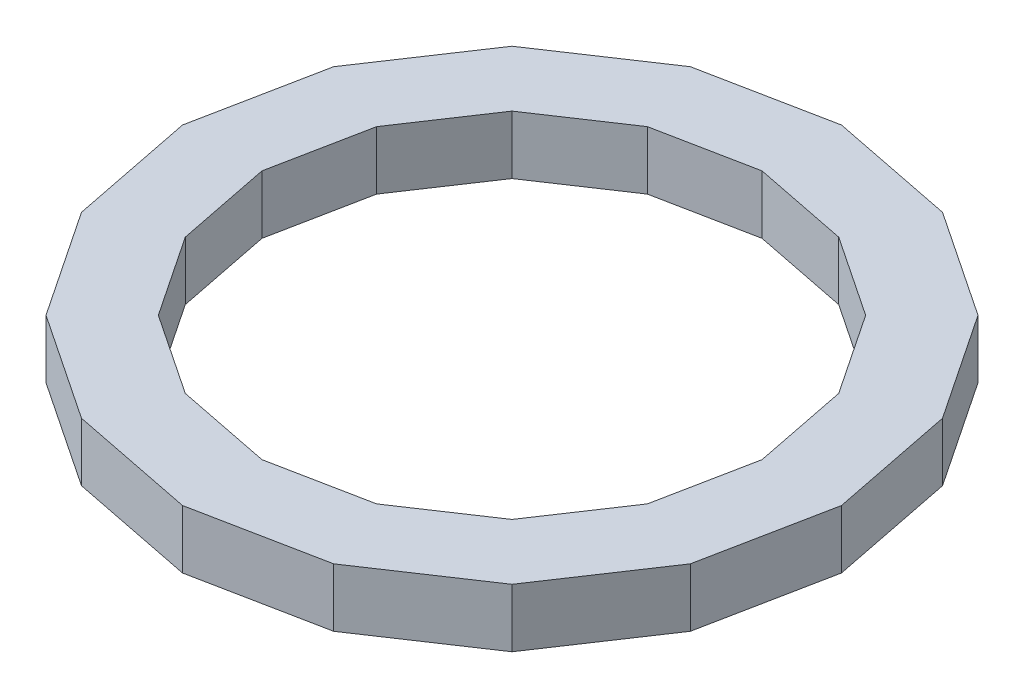
ISO-10303-21;
HEADER;
FILE_DESCRIPTION(('STEP AP214'),'2;1');
FILE_NAME('part.step','',(''),(''),'','','');
FILE_SCHEMA(('AUTOMOTIVE_DESIGN { 1 0 10303 214 1 1 1 1 }'));
ENDSEC;
DATA;
#1=APPLICATION_CONTEXT('core data for automotive mechanical design processes');
#2=APPLICATION_PROTOCOL_DEFINITION('international standard','automotive_design',2000,#1);
#3=PRODUCT_CONTEXT('',#1,'mechanical');
#4=PRODUCT('Part','Part','',(#3));
#5=PRODUCT_RELATED_PRODUCT_CATEGORY('part','',(#4));
#6=PRODUCT_DEFINITION_FORMATION('','',#4);
#7=PRODUCT_DEFINITION_CONTEXT('part definition',#1,'design');
#8=PRODUCT_DEFINITION('design','',#6,#7);
#9=PRODUCT_DEFINITION_SHAPE('','',#8);
#10=(LENGTH_UNIT() NAMED_UNIT(*) SI_UNIT(.MILLI.,.METRE.));
#11=(NAMED_UNIT(*) PLANE_ANGLE_UNIT() SI_UNIT($,.RADIAN.));
#12=(NAMED_UNIT(*) SI_UNIT($,.STERADIAN.) SOLID_ANGLE_UNIT());
#13=UNCERTAINTY_MEASURE_WITH_UNIT(LENGTH_MEASURE(1.E-05),#10,'distance_accuracy_value','');
#14=(GEOMETRIC_REPRESENTATION_CONTEXT(3) GLOBAL_UNCERTAINTY_ASSIGNED_CONTEXT((#13)) GLOBAL_UNIT_ASSIGNED_CONTEXT((#10,
#11,#12)) REPRESENTATION_CONTEXT('',''));
#15=CARTESIAN_POINT('',(0.,0.,0.));
#16=DIRECTION('',(0.,0.,1.));
#17=DIRECTION('',(1.,0.,0.));
#18=AXIS2_PLACEMENT_3D('',#15,#16,#17);
#19=CARTESIAN_POINT('',(0.,19.05,0.));
#20=DIRECTION('',(0.,1.,0.));
#21=DIRECTION('',(0.,0.,1.));
#22=AXIS2_PLACEMENT_3D('',#19,#20,#21);
#23=PLANE('',#22);
#24=DIRECTION('',(0.195090322016117,0.,-0.980785280403233));
#25=VECTOR('',#24,1.);
#26=CARTESIAN_POINT('',(99.2355510191511,19.05,41.1047111016982));
#27=LINE('',#26,#25);
#28=CARTESIAN_POINT('',(99.2355510191511,19.05,41.1047111016982));
#29=VERTEX_POINT('',#28);
#30=CARTESIAN_POINT('',(107.411786414847,19.05,-1.22818165278149E-12));
#31=VERTEX_POINT('',#30);
#32=EDGE_CURVE('E370',#29,#31,#27,.T.);
#33=ORIENTED_EDGE('',*,*,#32,.T.);
#34=DIRECTION('',(-0.195090322016139,0.,-0.980785280403228));
#35=VECTOR('',#34,1.);
#36=CARTESIAN_POINT('',(107.411786414847,19.05,-1.22818165278149E-12));
#37=LINE('',#36,#35);
#38=CARTESIAN_POINT('',(99.2355510191502,19.05,-41.1047111017005));
#39=VERTEX_POINT('',#38);
#40=EDGE_CURVE('E373',#31,#39,#37,.T.);
#41=ORIENTED_EDGE('',*,*,#40,.T.);
#42=DIRECTION('',(-0.555570233019612,0.,-0.831469612302539));
#43=VECTOR('',#42,1.);
#44=CARTESIAN_POINT('',(99.2355510191502,19.05,-41.1047111017005));
#45=LINE('',#44,#43);
#46=CARTESIAN_POINT('',(75.9516025532982,19.05,-75.9516025532999));
#47=VERTEX_POINT('',#46);
#48=EDGE_CURVE('E376',#39,#47,#45,.T.);
#49=ORIENTED_EDGE('',*,*,#48,.T.);
#50=DIRECTION('',(-0.831469612302552,0.,-0.555570233019593));
#51=VECTOR('',#50,1.);
#52=CARTESIAN_POINT('',(75.9516025532982,19.05,-75.9516025532999));
#53=LINE('',#52,#51);
#54=CARTESIAN_POINT('',(41.1047111016984,19.05,-99.235551019151));
#55=VERTEX_POINT('',#54);
#56=EDGE_CURVE('E378',#47,#55,#53,.T.);
#57=ORIENTED_EDGE('',*,*,#56,.T.);
#58=DIRECTION('',(-0.980785280403233,0.,-0.195090322016117));
#59=VECTOR('',#58,1.);
#60=CARTESIAN_POINT('',(41.1047111016984,19.05,-99.235551019151));
#61=LINE('',#60,#59);
#62=CARTESIAN_POINT('',(-1.26318645391088E-12,19.05,-107.411786414846));
#63=VERTEX_POINT('',#62);
#64=EDGE_CURVE('E380',#55,#63,#61,.T.);
#65=ORIENTED_EDGE('',*,*,#64,.T.);
#66=DIRECTION('',(-0.980785280403228,0.,0.195090322016139));
#67=VECTOR('',#66,1.);
#68=CARTESIAN_POINT('',(-1.26318645391088E-12,19.05,-107.411786414846));
#69=LINE('',#68,#67);
#70=CARTESIAN_POINT('',(-41.1047111017004,19.05,-99.2355510191501));
#71=VERTEX_POINT('',#70);
#72=EDGE_CURVE('E382',#63,#71,#69,.T.);
#73=ORIENTED_EDGE('',*,*,#72,.T.);
#74=DIRECTION('',(-0.831469612302539,0.,0.555570233019612));
#75=VECTOR('',#74,1.);
#76=CARTESIAN_POINT('',(-41.1047111017004,19.05,-99.2355510191501));
#77=LINE('',#76,#75);
#78=CARTESIAN_POINT('',(-75.9516025532999,19.05,-75.9516025532981));
#79=VERTEX_POINT('',#78);
#80=EDGE_CURVE('E384',#71,#79,#77,.T.);
#81=ORIENTED_EDGE('',*,*,#80,.T.);
#82=DIRECTION('',(-0.555570233019593,0.,0.831469612302551));
#83=VECTOR('',#82,1.);
#84=CARTESIAN_POINT('',(-75.9516025532999,19.05,-75.9516025532981));
#85=LINE('',#84,#83);
#86=CARTESIAN_POINT('',(-99.235551019151,19.05,-41.1047111016983));
#87=VERTEX_POINT('',#86);
#88=EDGE_CURVE('E386',#79,#87,#85,.T.);
#89=ORIENTED_EDGE('',*,*,#88,.T.);
#90=DIRECTION('',(-0.195090322016117,0.,0.980785280403233));
#91=VECTOR('',#90,1.);
#92=CARTESIAN_POINT('',(-99.235551019151,19.05,-41.1047111016983));
#93=LINE('',#92,#91);
#94=CARTESIAN_POINT('',(-107.411786414846,19.05,1.29125826178143E-12));
#95=VERTEX_POINT('',#94);
#96=EDGE_CURVE('E389',#87,#95,#93,.T.);
#97=ORIENTED_EDGE('',*,*,#96,.T.);
#98=DIRECTION('',(0.195090322016139,0.,0.980785280403228));
#99=VECTOR('',#98,1.);
#100=CARTESIAN_POINT('',(-107.411786414846,19.05,1.29125826178143E-12));
#101=LINE('',#100,#99);
#102=CARTESIAN_POINT('',(-99.2355510191501,19.05,41.1047111017005));
#103=VERTEX_POINT('',#102);
#104=EDGE_CURVE('E391',#95,#103,#101,.T.);
#105=ORIENTED_EDGE('',*,*,#104,.T.);
#106=DIRECTION('',(0.555570233019612,0.,0.831469612302539));
#107=VECTOR('',#106,1.);
#108=CARTESIAN_POINT('',(-99.2355510191501,19.05,41.1047111017005));
#109=LINE('',#108,#107);
#110=CARTESIAN_POINT('',(-75.9516025532982,19.05,75.9516025532999));
#111=VERTEX_POINT('',#110);
#112=EDGE_CURVE('E393',#103,#111,#109,.T.);
#113=ORIENTED_EDGE('',*,*,#112,.T.);
#114=DIRECTION('',(0.831469612302552,0.,0.555570233019593));
#115=VECTOR('',#114,1.);
#116=CARTESIAN_POINT('',(-75.9516025532982,19.05,75.9516025532999));
#117=LINE('',#116,#115);
#118=CARTESIAN_POINT('',(-41.1047111016982,19.05,99.2355510191511));
#119=VERTEX_POINT('',#118);
#120=EDGE_CURVE('E396',#111,#119,#117,.T.);
#121=ORIENTED_EDGE('',*,*,#120,.T.);
#122=DIRECTION('',(0.980785280403233,0.,0.195090322016117));
#123=VECTOR('',#122,1.);
#124=CARTESIAN_POINT('',(-41.1047111016982,19.05,99.2355510191511));
#125=LINE('',#124,#123);
#126=CARTESIAN_POINT('',(1.20605816303914E-12,19.05,107.411786414847));
#127=VERTEX_POINT('',#126);
#128=EDGE_CURVE('E399',#119,#127,#125,.T.);
#129=ORIENTED_EDGE('',*,*,#128,.T.);
#130=DIRECTION('',(0.980785280403228,0.,-0.195090322016139));
#131=VECTOR('',#130,1.);
#132=CARTESIAN_POINT('',(1.20605816303914E-12,19.05,107.411786414847));
#133=LINE('',#132,#131);
#134=CARTESIAN_POINT('',(41.1047111017004,19.05,99.2355510191502));
#135=VERTEX_POINT('',#134);
#136=EDGE_CURVE('E401',#127,#135,#133,.T.);
#137=ORIENTED_EDGE('',*,*,#136,.T.);
#138=DIRECTION('',(0.831469612302539,0.,-0.555570233019612));
#139=VECTOR('',#138,1.);
#140=CARTESIAN_POINT('',(41.1047111017004,19.05,99.2355510191502));
#141=LINE('',#140,#139);
#142=CARTESIAN_POINT('',(75.9516025532999,19.05,75.9516025532982));
#143=VERTEX_POINT('',#142);
#144=EDGE_CURVE('E404',#135,#143,#141,.T.);
#145=ORIENTED_EDGE('',*,*,#144,.T.);
#146=DIRECTION('',(0.555570233019593,0.,-0.831469612302551));
#147=VECTOR('',#146,1.);
#148=CARTESIAN_POINT('',(75.9516025532999,19.05,75.9516025532982));
#149=LINE('',#148,#147);
#150=EDGE_CURVE('E407',#143,#29,#149,.T.);
#151=ORIENTED_EDGE('',*,*,#150,.T.);
#152=EDGE_LOOP('',(#33,#41,#49,#57,#65,#73,#81,#89,#97,#105,#113,#121,#129,#137,#145,#151));
#153=FACE_BOUND('',#152,.T.);
#154=DIRECTION('',(-0.195090322016139,0.,-0.980785280403228));
#155=VECTOR('',#154,1.);
#156=CARTESIAN_POINT('',(81.5141709963552,19.05,-9.22781849097873E-13));
#157=LINE('',#156,#155);
#158=CARTESIAN_POINT('',(81.5141709963552,19.05,-9.22781849097873E-13));
#159=VERTEX_POINT('',#158);
#160=CARTESIAN_POINT('',(75.3092741931574,19.05,-31.1941227432809));
#161=VERTEX_POINT('',#160);
#162=EDGE_CURVE('E252',#159,#161,#157,.T.);
#163=ORIENTED_EDGE('',*,*,#162,.F.);
#164=DIRECTION('',(0.195090322016117,0.,-0.980785280403233));
#165=VECTOR('',#164,1.);
#166=CARTESIAN_POINT('',(75.3092741931581,19.05,31.1941227432793));
#167=LINE('',#166,#165);
#168=CARTESIAN_POINT('',(75.3092741931581,19.05,31.1941227432793));
#169=VERTEX_POINT('',#168);
#170=EDGE_CURVE('E243',#169,#159,#167,.T.);
#171=ORIENTED_EDGE('',*,*,#170,.F.);
#172=DIRECTION('',(0.555570233019593,0.,-0.831469612302552));
#173=VECTOR('',#172,1.);
#174=CARTESIAN_POINT('',(57.6392230743233,19.05,57.6392230743219));
#175=LINE('',#174,#173);
#176=CARTESIAN_POINT('',(57.6392230743233,19.05,57.6392230743219));
#177=VERTEX_POINT('',#176);
#178=EDGE_CURVE('E295',#177,#169,#175,.T.);
#179=ORIENTED_EDGE('',*,*,#178,.F.);
#180=DIRECTION('',(0.831469612302539,0.,-0.555570233019612));
#181=VECTOR('',#180,1.);
#182=CARTESIAN_POINT('',(31.194122743281,19.05,75.3092741931574));
#183=LINE('',#182,#181);
#184=CARTESIAN_POINT('',(31.194122743281,19.05,75.3092741931574));
#185=VERTEX_POINT('',#184);
#186=EDGE_CURVE('E293',#185,#177,#183,.T.);
#187=ORIENTED_EDGE('',*,*,#186,.F.);
#188=DIRECTION('',(0.980785280403228,0.,-0.19509032201614));
#189=VECTOR('',#188,1.);
#190=CARTESIAN_POINT('',(9.34889372670336E-13,19.05,81.5141709963552));
#191=LINE('',#190,#189);
#192=CARTESIAN_POINT('',(9.34889372670336E-13,19.05,81.5141709963552));
#193=VERTEX_POINT('',#192);
#194=EDGE_CURVE('E291',#193,#185,#191,.T.);
#195=ORIENTED_EDGE('',*,*,#194,.F.);
#196=DIRECTION('',(0.980785280403233,0.,0.195090322016117));
#197=VECTOR('',#196,1.);
#198=CARTESIAN_POINT('',(-31.1941227432792,19.05,75.3092741931581));
#199=LINE('',#198,#197);
#200=CARTESIAN_POINT('',(-31.1941227432792,19.05,75.3092741931581));
#201=VERTEX_POINT('',#200);
#202=EDGE_CURVE('E289',#201,#193,#199,.T.);
#203=ORIENTED_EDGE('',*,*,#202,.F.);
#204=DIRECTION('',(0.831469612302552,0.,0.555570233019593));
#205=VECTOR('',#204,1.);
#206=CARTESIAN_POINT('',(-57.6392230743219,19.05,57.6392230743233));
#207=LINE('',#206,#205);
#208=CARTESIAN_POINT('',(-57.6392230743219,19.05,57.6392230743233));
#209=VERTEX_POINT('',#208);
#210=EDGE_CURVE('E287',#209,#201,#207,.T.);
#211=ORIENTED_EDGE('',*,*,#210,.F.);
#212=DIRECTION('',(0.555570233019612,0.,0.831469612302539));
#213=VECTOR('',#212,1.);
#214=CARTESIAN_POINT('',(-75.3092741931574,19.05,31.1941227432809));
#215=LINE('',#214,#213);
#216=CARTESIAN_POINT('',(-75.3092741931574,19.05,31.1941227432809));
#217=VERTEX_POINT('',#216);
#218=EDGE_CURVE('E285',#217,#209,#215,.T.);
#219=ORIENTED_EDGE('',*,*,#218,.F.);
#220=DIRECTION('',(0.195090322016139,0.,0.980785280403228));
#221=VECTOR('',#220,1.);
#222=CARTESIAN_POINT('',(-81.5141709963552,19.05,9.90744858322315E-13));
#223=LINE('',#222,#221);
#224=CARTESIAN_POINT('',(-81.5141709963552,19.05,9.90744858322315E-13));
#225=VERTEX_POINT('',#224);
#226=EDGE_CURVE('E283',#225,#217,#223,.T.);
#227=ORIENTED_EDGE('',*,*,#226,.F.);
#228=DIRECTION('',(-0.195090322016117,0.,0.980785280403233));
#229=VECTOR('',#228,1.);
#230=CARTESIAN_POINT('',(-75.3092741931581,19.05,-31.1941227432792));
#231=LINE('',#230,#229);
#232=CARTESIAN_POINT('',(-75.3092741931581,19.05,-31.1941227432792));
#233=VERTEX_POINT('',#232);
#234=EDGE_CURVE('E280',#233,#225,#231,.T.);
#235=ORIENTED_EDGE('',*,*,#234,.F.);
#236=DIRECTION('',(-0.555570233019592,0.,0.831469612302552));
#237=VECTOR('',#236,1.);
#238=CARTESIAN_POINT('',(-57.6392230743232,19.05,-57.6392230743218));
#239=LINE('',#238,#237);
#240=CARTESIAN_POINT('',(-57.6392230743232,19.05,-57.6392230743218));
#241=VERTEX_POINT('',#240);
#242=EDGE_CURVE('E277',#241,#233,#239,.T.);
#243=ORIENTED_EDGE('',*,*,#242,.F.);
#244=DIRECTION('',(-0.831469612302539,0.,0.555570233019612));
#245=VECTOR('',#244,1.);
#246=CARTESIAN_POINT('',(-31.1941227432809,19.05,-75.3092741931574));
#247=LINE('',#246,#245);
#248=CARTESIAN_POINT('',(-31.1941227432809,19.05,-75.3092741931574));
#249=VERTEX_POINT('',#248);
#250=EDGE_CURVE('E275',#249,#241,#247,.T.);
#251=ORIENTED_EDGE('',*,*,#250,.F.);
#252=DIRECTION('',(-0.980785280403228,0.,0.19509032201614));
#253=VECTOR('',#252,1.);
#254=CARTESIAN_POINT('',(-9.92922192206594E-13,19.05,-81.5141709963552));
#255=LINE('',#254,#253);
#256=CARTESIAN_POINT('',(-9.92922192206594E-13,19.05,-81.5141709963552));
#257=VERTEX_POINT('',#256);
#258=EDGE_CURVE('E273',#257,#249,#255,.T.);
#259=ORIENTED_EDGE('',*,*,#258,.F.);
#260=DIRECTION('',(-0.980785280403233,0.,-0.195090322016117));
#261=VECTOR('',#260,1.);
#262=CARTESIAN_POINT('',(31.1941227432793,19.05,-75.309274193158));
#263=LINE('',#262,#261);
#264=CARTESIAN_POINT('',(31.1941227432793,19.05,-75.309274193158));
#265=VERTEX_POINT('',#264);
#266=EDGE_CURVE('E271',#265,#257,#263,.T.);
#267=ORIENTED_EDGE('',*,*,#266,.F.);
#268=DIRECTION('',(-0.831469612302552,0.,-0.555570233019592));
#269=VECTOR('',#268,1.);
#270=CARTESIAN_POINT('',(57.6392230743219,19.05,-57.6392230743232));
#271=LINE('',#270,#269);
#272=CARTESIAN_POINT('',(57.6392230743219,19.05,-57.6392230743232));
#273=VERTEX_POINT('',#272);
#274=EDGE_CURVE('E267',#273,#265,#271,.T.);
#275=ORIENTED_EDGE('',*,*,#274,.F.);
#276=DIRECTION('',(-0.555570233019612,0.,-0.831469612302539));
#277=VECTOR('',#276,1.);
#278=CARTESIAN_POINT('',(75.3092741931574,19.05,-31.1941227432809));
#279=LINE('',#278,#277);
#280=EDGE_CURVE('E265',#161,#273,#279,.T.);
#281=ORIENTED_EDGE('',*,*,#280,.F.);
#282=EDGE_LOOP('',(#163,#171,#179,#187,#195,#203,#211,#219,#227,#235,#243,#251,#259,#267,#275,#281));
#283=FACE_BOUND('',#282,.T.);
#284=ADVANCED_FACE('F34',(#153,#283),#23,.T.);
#285=CARTESIAN_POINT('',(0.,0.,0.));
#286=DIRECTION('',(0.,1.,0.));
#287=DIRECTION('',(0.,0.,1.));
#288=AXIS2_PLACEMENT_3D('',#285,#286,#287);
#289=PLANE('',#288);
#290=DIRECTION('',(0.195090322016117,0.,-0.980785280403233));
#291=VECTOR('',#290,1.);
#292=CARTESIAN_POINT('',(99.2355510191511,0.,41.1047111016982));
#293=LINE('',#292,#291);
#294=CARTESIAN_POINT('',(99.2355510191511,0.,41.1047111016982));
#295=VERTEX_POINT('',#294);
#296=CARTESIAN_POINT('',(107.411786414847,0.,-1.22818165278149E-12));
#297=VERTEX_POINT('',#296);
#298=EDGE_CURVE('E260',#295,#297,#293,.T.);
#299=ORIENTED_EDGE('',*,*,#298,.F.);
#300=DIRECTION('',(0.555570233019593,0.,-0.831469612302551));
#301=VECTOR('',#300,1.);
#302=CARTESIAN_POINT('',(75.9516025532999,0.,75.9516025532982));
#303=LINE('',#302,#301);
#304=CARTESIAN_POINT('',(75.9516025532999,0.,75.9516025532982));
#305=VERTEX_POINT('',#304);
#306=EDGE_CURVE('E374',#305,#295,#303,.T.);
#307=ORIENTED_EDGE('',*,*,#306,.F.);
#308=DIRECTION('',(0.831469612302539,0.,-0.555570233019612));
#309=VECTOR('',#308,1.);
#310=CARTESIAN_POINT('',(41.1047111017004,0.,99.2355510191502));
#311=LINE('',#310,#309);
#312=CARTESIAN_POINT('',(41.1047111017004,0.,99.2355510191502));
#313=VERTEX_POINT('',#312);
#314=EDGE_CURVE('E442',#313,#305,#311,.T.);
#315=ORIENTED_EDGE('',*,*,#314,.F.);
#316=DIRECTION('',(0.980785280403228,0.,-0.195090322016139));
#317=VECTOR('',#316,1.);
#318=CARTESIAN_POINT('',(1.20605816303914E-12,0.,107.411786414847));
#319=LINE('',#318,#317);
#320=CARTESIAN_POINT('',(1.20605816303914E-12,0.,107.411786414847));
#321=VERTEX_POINT('',#320);
#322=EDGE_CURVE('E439',#321,#313,#319,.T.);
#323=ORIENTED_EDGE('',*,*,#322,.F.);
#324=DIRECTION('',(0.980785280403233,0.,0.195090322016117));
#325=VECTOR('',#324,1.);
#326=CARTESIAN_POINT('',(-41.1047111016982,0.,99.2355510191511));
#327=LINE('',#326,#325);
#328=CARTESIAN_POINT('',(-41.1047111016982,0.,99.2355510191511));
#329=VERTEX_POINT('',#328);
#330=EDGE_CURVE('E436',#329,#321,#327,.T.);
#331=ORIENTED_EDGE('',*,*,#330,.F.);
#332=DIRECTION('',(0.831469612302552,0.,0.555570233019593));
#333=VECTOR('',#332,1.);
#334=CARTESIAN_POINT('',(-75.9516025532982,0.,75.9516025532999));
#335=LINE('',#334,#333);
#336=CARTESIAN_POINT('',(-75.9516025532982,0.,75.9516025532999));
#337=VERTEX_POINT('',#336);
#338=EDGE_CURVE('E433',#337,#329,#335,.T.);
#339=ORIENTED_EDGE('',*,*,#338,.F.);
#340=DIRECTION('',(0.555570233019612,0.,0.831469612302539));
#341=VECTOR('',#340,1.);
#342=CARTESIAN_POINT('',(-99.2355510191501,0.,41.1047111017005));
#343=LINE('',#342,#341);
#344=CARTESIAN_POINT('',(-99.2355510191501,0.,41.1047111017005));
#345=VERTEX_POINT('',#344);
#346=EDGE_CURVE('E431',#345,#337,#343,.T.);
#347=ORIENTED_EDGE('',*,*,#346,.F.);
#348=DIRECTION('',(0.195090322016139,0.,0.980785280403228));
#349=VECTOR('',#348,1.);
#350=CARTESIAN_POINT('',(-107.411786414846,0.,1.29125826178143E-12));
#351=LINE('',#350,#349);
#352=CARTESIAN_POINT('',(-107.411786414846,0.,1.29125826178143E-12));
#353=VERTEX_POINT('',#352);
#354=EDGE_CURVE('E428',#353,#345,#351,.T.);
#355=ORIENTED_EDGE('',*,*,#354,.F.);
#356=DIRECTION('',(-0.195090322016117,0.,0.980785280403233));
#357=VECTOR('',#356,1.);
#358=CARTESIAN_POINT('',(-99.235551019151,0.,-41.1047111016983));
#359=LINE('',#358,#357);
#360=CARTESIAN_POINT('',(-99.235551019151,0.,-41.1047111016983));
#361=VERTEX_POINT('',#360);
#362=EDGE_CURVE('E426',#361,#353,#359,.T.);
#363=ORIENTED_EDGE('',*,*,#362,.F.);
#364=DIRECTION('',(-0.555570233019593,0.,0.831469612302551));
#365=VECTOR('',#364,1.);
#366=CARTESIAN_POINT('',(-75.9516025532999,0.,-75.9516025532981));
#367=LINE('',#366,#365);
#368=CARTESIAN_POINT('',(-75.9516025532999,0.,-75.9516025532981));
#369=VERTEX_POINT('',#368);
#370=EDGE_CURVE('E424',#369,#361,#367,.T.);
#371=ORIENTED_EDGE('',*,*,#370,.F.);
#372=DIRECTION('',(-0.831469612302539,0.,0.555570233019612));
#373=VECTOR('',#372,1.);
#374=CARTESIAN_POINT('',(-41.1047111017004,0.,-99.2355510191501));
#375=LINE('',#374,#373);
#376=CARTESIAN_POINT('',(-41.1047111017004,0.,-99.2355510191501));
#377=VERTEX_POINT('',#376);
#378=EDGE_CURVE('E422',#377,#369,#375,.T.);
#379=ORIENTED_EDGE('',*,*,#378,.F.);
#380=DIRECTION('',(-0.980785280403228,0.,0.195090322016139));
#381=VECTOR('',#380,1.);
#382=CARTESIAN_POINT('',(-1.26318645391088E-12,0.,-107.411786414846));
#383=LINE('',#382,#381);
#384=CARTESIAN_POINT('',(-1.26318645391088E-12,0.,-107.411786414846));
#385=VERTEX_POINT('',#384);
#386=EDGE_CURVE('E420',#385,#377,#383,.T.);
#387=ORIENTED_EDGE('',*,*,#386,.F.);
#388=DIRECTION('',(-0.980785280403233,0.,-0.195090322016117));
#389=VECTOR('',#388,1.);
#390=CARTESIAN_POINT('',(41.1047111016984,0.,-99.235551019151));
#391=LINE('',#390,#389);
#392=CARTESIAN_POINT('',(41.1047111016984,0.,-99.235551019151));
#393=VERTEX_POINT('',#392);
#394=EDGE_CURVE('E418',#393,#385,#391,.T.);
#395=ORIENTED_EDGE('',*,*,#394,.F.);
#396=DIRECTION('',(-0.831469612302552,0.,-0.555570233019593));
#397=VECTOR('',#396,1.);
#398=CARTESIAN_POINT('',(75.9516025532982,0.,-75.9516025532999));
#399=LINE('',#398,#397);
#400=CARTESIAN_POINT('',(75.9516025532982,0.,-75.9516025532999));
#401=VERTEX_POINT('',#400);
#402=EDGE_CURVE('E416',#401,#393,#399,.T.);
#403=ORIENTED_EDGE('',*,*,#402,.F.);
#404=DIRECTION('',(-0.555570233019612,0.,-0.831469612302539));
#405=VECTOR('',#404,1.);
#406=CARTESIAN_POINT('',(99.2355510191502,0.,-41.1047111017005));
#407=LINE('',#406,#405);
#408=CARTESIAN_POINT('',(99.2355510191502,0.,-41.1047111017005));
#409=VERTEX_POINT('',#408);
#410=EDGE_CURVE('E414',#409,#401,#407,.T.);
#411=ORIENTED_EDGE('',*,*,#410,.F.);
#412=DIRECTION('',(-0.195090322016139,0.,-0.980785280403228));
#413=VECTOR('',#412,1.);
#414=CARTESIAN_POINT('',(107.411786414847,0.,-1.22818165278149E-12));
#415=LINE('',#414,#413);
#416=EDGE_CURVE('E412',#297,#409,#415,.T.);
#417=ORIENTED_EDGE('',*,*,#416,.F.);
#418=EDGE_LOOP('',(#299,#307,#315,#323,#331,#339,#347,#355,#363,#371,#379,#387,#395,#403,#411,#417));
#419=FACE_BOUND('',#418,.T.);
#420=DIRECTION('',(0.195090322016117,0.,-0.980785280403233));
#421=VECTOR('',#420,1.);
#422=CARTESIAN_POINT('',(75.3092741931581,0.,31.1941227432793));
#423=LINE('',#422,#421);
#424=CARTESIAN_POINT('',(75.3092741931581,0.,31.1941227432793));
#425=VERTEX_POINT('',#424);
#426=CARTESIAN_POINT('',(81.5141709963552,0.,-9.22781849097873E-13));
#427=VERTEX_POINT('',#426);
#428=EDGE_CURVE('E57',#425,#427,#423,.T.);
#429=ORIENTED_EDGE('',*,*,#428,.T.);
#430=DIRECTION('',(-0.195090322016139,0.,-0.980785280403228));
#431=VECTOR('',#430,1.);
#432=CARTESIAN_POINT('',(81.5141709963552,0.,-9.22781849097873E-13));
#433=LINE('',#432,#431);
#434=CARTESIAN_POINT('',(75.3092741931574,0.,-31.1941227432809));
#435=VERTEX_POINT('',#434);
#436=EDGE_CURVE('E259',#427,#435,#433,.T.);
#437=ORIENTED_EDGE('',*,*,#436,.T.);
#438=DIRECTION('',(-0.555570233019612,0.,-0.831469612302539));
#439=VECTOR('',#438,1.);
#440=CARTESIAN_POINT('',(75.3092741931574,0.,-31.1941227432809));
#441=LINE('',#440,#439);
#442=CARTESIAN_POINT('',(57.6392230743219,0.,-57.6392230743232));
#443=VERTEX_POINT('',#442);
#444=EDGE_CURVE('E299',#435,#443,#441,.T.);
#445=ORIENTED_EDGE('',*,*,#444,.T.);
#446=DIRECTION('',(-0.831469612302552,0.,-0.555570233019592));
#447=VECTOR('',#446,1.);
#448=CARTESIAN_POINT('',(57.6392230743219,0.,-57.6392230743232));
#449=LINE('',#448,#447);
#450=CARTESIAN_POINT('',(31.1941227432793,0.,-75.309274193158));
#451=VERTEX_POINT('',#450);
#452=EDGE_CURVE('E302',#443,#451,#449,.T.);
#453=ORIENTED_EDGE('',*,*,#452,.T.);
#454=DIRECTION('',(-0.980785280403233,0.,-0.195090322016117));
#455=VECTOR('',#454,1.);
#456=CARTESIAN_POINT('',(31.1941227432793,0.,-75.309274193158));
#457=LINE('',#456,#455);
#458=CARTESIAN_POINT('',(-9.92922192206594E-13,0.,-81.5141709963552));
#459=VERTEX_POINT('',#458);
#460=EDGE_CURVE('E305',#451,#459,#457,.T.);
#461=ORIENTED_EDGE('',*,*,#460,.T.);
#462=DIRECTION('',(-0.980785280403228,0.,0.19509032201614));
#463=VECTOR('',#462,1.);
#464=CARTESIAN_POINT('',(-9.92922192206594E-13,0.,-81.5141709963552));
#465=LINE('',#464,#463);
#466=CARTESIAN_POINT('',(-31.1941227432809,0.,-75.3092741931574));
#467=VERTEX_POINT('',#466);
#468=EDGE_CURVE('E308',#459,#467,#465,.T.);
#469=ORIENTED_EDGE('',*,*,#468,.T.);
#470=DIRECTION('',(-0.831469612302539,0.,0.555570233019612));
#471=VECTOR('',#470,1.);
#472=CARTESIAN_POINT('',(-31.1941227432809,0.,-75.3092741931574));
#473=LINE('',#472,#471);
#474=CARTESIAN_POINT('',(-57.6392230743232,0.,-57.6392230743218));
#475=VERTEX_POINT('',#474);
#476=EDGE_CURVE('E311',#467,#475,#473,.T.);
#477=ORIENTED_EDGE('',*,*,#476,.T.);
#478=DIRECTION('',(-0.555570233019592,0.,0.831469612302552));
#479=VECTOR('',#478,1.);
#480=CARTESIAN_POINT('',(-57.6392230743232,0.,-57.6392230743218));
#481=LINE('',#480,#479);
#482=CARTESIAN_POINT('',(-75.3092741931581,0.,-31.1941227432792));
#483=VERTEX_POINT('',#482);
#484=EDGE_CURVE('E314',#475,#483,#481,.T.);
#485=ORIENTED_EDGE('',*,*,#484,.T.);
#486=DIRECTION('',(-0.195090322016117,0.,0.980785280403233));
#487=VECTOR('',#486,1.);
#488=CARTESIAN_POINT('',(-75.3092741931581,0.,-31.1941227432792));
#489=LINE('',#488,#487);
#490=CARTESIAN_POINT('',(-81.5141709963552,0.,9.90744858322315E-13));
#491=VERTEX_POINT('',#490);
#492=EDGE_CURVE('E317',#483,#491,#489,.T.);
#493=ORIENTED_EDGE('',*,*,#492,.T.);
#494=DIRECTION('',(0.195090322016139,0.,0.980785280403228));
#495=VECTOR('',#494,1.);
#496=CARTESIAN_POINT('',(-81.5141709963552,0.,9.90744858322315E-13));
#497=LINE('',#496,#495);
#498=CARTESIAN_POINT('',(-75.3092741931574,0.,31.1941227432809));
#499=VERTEX_POINT('',#498);
#500=EDGE_CURVE('E321',#491,#499,#497,.T.);
#501=ORIENTED_EDGE('',*,*,#500,.T.);
#502=DIRECTION('',(0.555570233019612,0.,0.831469612302539));
#503=VECTOR('',#502,1.);
#504=CARTESIAN_POINT('',(-75.3092741931574,0.,31.1941227432809));
#505=LINE('',#504,#503);
#506=CARTESIAN_POINT('',(-57.6392230743219,0.,57.6392230743233));
#507=VERTEX_POINT('',#506);
#508=EDGE_CURVE('E324',#499,#507,#505,.T.);
#509=ORIENTED_EDGE('',*,*,#508,.T.);
#510=DIRECTION('',(0.831469612302552,0.,0.555570233019593));
#511=VECTOR('',#510,1.);
#512=CARTESIAN_POINT('',(-57.6392230743219,0.,57.6392230743233));
#513=LINE('',#512,#511);
#514=CARTESIAN_POINT('',(-31.1941227432792,0.,75.3092741931581));
#515=VERTEX_POINT('',#514);
#516=EDGE_CURVE('E327',#507,#515,#513,.T.);
#517=ORIENTED_EDGE('',*,*,#516,.T.);
#518=DIRECTION('',(0.980785280403233,0.,0.195090322016117));
#519=VECTOR('',#518,1.);
#520=CARTESIAN_POINT('',(-31.1941227432792,0.,75.3092741931581));
#521=LINE('',#520,#519);
#522=CARTESIAN_POINT('',(9.34889372670336E-13,0.,81.5141709963552));
#523=VERTEX_POINT('',#522);
#524=EDGE_CURVE('E330',#515,#523,#521,.T.);
#525=ORIENTED_EDGE('',*,*,#524,.T.);
#526=DIRECTION('',(0.980785280403228,0.,-0.19509032201614));
#527=VECTOR('',#526,1.);
#528=CARTESIAN_POINT('',(9.34889372670336E-13,0.,81.5141709963552));
#529=LINE('',#528,#527);
#530=CARTESIAN_POINT('',(31.194122743281,0.,75.3092741931574));
#531=VERTEX_POINT('',#530);
#532=EDGE_CURVE('E333',#523,#531,#529,.T.);
#533=ORIENTED_EDGE('',*,*,#532,.T.);
#534=DIRECTION('',(0.831469612302539,0.,-0.555570233019612));
#535=VECTOR('',#534,1.);
#536=CARTESIAN_POINT('',(31.194122743281,0.,75.3092741931574));
#537=LINE('',#536,#535);
#538=CARTESIAN_POINT('',(57.6392230743233,0.,57.6392230743219));
#539=VERTEX_POINT('',#538);
#540=EDGE_CURVE('E336',#531,#539,#537,.T.);
#541=ORIENTED_EDGE('',*,*,#540,.T.);
#542=DIRECTION('',(0.555570233019593,0.,-0.831469612302552));
#543=VECTOR('',#542,1.);
#544=CARTESIAN_POINT('',(57.6392230743233,0.,57.6392230743219));
#545=LINE('',#544,#543);
#546=EDGE_CURVE('E253',#539,#425,#545,.T.);
#547=ORIENTED_EDGE('',*,*,#546,.T.);
#548=EDGE_LOOP('',(#429,#437,#445,#453,#461,#469,#477,#485,#493,#501,#509,#517,#525,#533,#541,#547));
#549=FACE_BOUND('',#548,.T.);
#550=ADVANCED_FACE('F500',(#419,#549),#289,.F.);
#551=CARTESIAN_POINT('',(99.2355510191511,19.05,41.1047111016982));
#552=DIRECTION('',(-0.980785280403233,0.,-0.195090322016117));
#553=DIRECTION('',(-0.195090322016117,0.,0.980785280403233));
#554=AXIS2_PLACEMENT_3D('',#551,#552,#553);
#555=PLANE('',#554);
#556=ORIENTED_EDGE('',*,*,#298,.T.);
#557=DIRECTION('',(0.,-1.,0.));
#558=VECTOR('',#557,1.);
#559=CARTESIAN_POINT('',(107.411786414847,19.05,-1.22818165278149E-12));
#560=LINE('',#559,#558);
#561=EDGE_CURVE('E11',#31,#297,#560,.T.);
#562=ORIENTED_EDGE('',*,*,#561,.F.);
#563=ORIENTED_EDGE('',*,*,#32,.F.);
#564=DIRECTION('',(0.,-1.,0.));
#565=VECTOR('',#564,1.);
#566=CARTESIAN_POINT('',(99.2355510191511,19.05,41.1047111016982));
#567=LINE('',#566,#565);
#568=EDGE_CURVE('E409',#29,#295,#567,.T.);
#569=ORIENTED_EDGE('',*,*,#568,.T.);
#570=EDGE_LOOP('',(#556,#562,#563,#569));
#571=FACE_BOUND('',#570,.T.);
#572=ADVANCED_FACE('F36',(#571),#555,.F.);
#573=CARTESIAN_POINT('',(107.411786414847,19.05,-1.22818165278149E-12));
#574=DIRECTION('',(-0.980785280403228,0.,0.195090322016139));
#575=DIRECTION('',(0.195090322016139,0.,0.980785280403228));
#576=AXIS2_PLACEMENT_3D('',#573,#574,#575);
#577=PLANE('',#576);
#578=ORIENTED_EDGE('',*,*,#416,.T.);
#579=DIRECTION('',(0.,-1.,0.));
#580=VECTOR('',#579,1.);
#581=CARTESIAN_POINT('',(99.2355510191502,19.05,-41.1047111017005));
#582=LINE('',#581,#580);
#583=EDGE_CURVE('E42',#39,#409,#582,.T.);
#584=ORIENTED_EDGE('',*,*,#583,.F.);
#585=ORIENTED_EDGE('',*,*,#40,.F.);
#586=ORIENTED_EDGE('',*,*,#561,.T.);
#587=EDGE_LOOP('',(#578,#584,#585,#586));
#588=FACE_BOUND('',#587,.T.);
#589=ADVANCED_FACE('F517',(#588),#577,.F.);
#590=CARTESIAN_POINT('',(99.2355510191502,19.05,-41.1047111017005));
#591=DIRECTION('',(-0.831469612302539,0.,0.555570233019612));
#592=DIRECTION('',(0.555570233019612,0.,0.831469612302539));
#593=AXIS2_PLACEMENT_3D('',#590,#591,#592);
#594=PLANE('',#593);
#595=ORIENTED_EDGE('',*,*,#410,.T.);
#596=DIRECTION('',(0.,-1.,0.));
#597=VECTOR('',#596,1.);
#598=CARTESIAN_POINT('',(75.9516025532982,19.05,-75.9516025532999));
#599=LINE('',#598,#597);
#600=EDGE_CURVE('E487',#47,#401,#599,.T.);
#601=ORIENTED_EDGE('',*,*,#600,.F.);
#602=ORIENTED_EDGE('',*,*,#48,.F.);
#603=ORIENTED_EDGE('',*,*,#583,.T.);
#604=EDGE_LOOP('',(#595,#601,#602,#603));
#605=FACE_BOUND('',#604,.T.);
#606=ADVANCED_FACE('F494',(#605),#594,.F.);
#607=CARTESIAN_POINT('',(75.9516025532982,19.05,-75.9516025532999));
#608=DIRECTION('',(-0.555570233019593,0.,0.831469612302552));
#609=DIRECTION('',(0.831469612302552,0.,0.555570233019593));
#610=AXIS2_PLACEMENT_3D('',#607,#608,#609);
#611=PLANE('',#610);
#612=ORIENTED_EDGE('',*,*,#402,.T.);
#613=DIRECTION('',(0.,-1.,0.));
#614=VECTOR('',#613,1.);
#615=CARTESIAN_POINT('',(41.1047111016984,19.05,-99.235551019151));
#616=LINE('',#615,#614);
#617=EDGE_CURVE('E483',#55,#393,#616,.T.);
#618=ORIENTED_EDGE('',*,*,#617,.F.);
#619=ORIENTED_EDGE('',*,*,#56,.F.);
#620=ORIENTED_EDGE('',*,*,#600,.T.);
#621=EDGE_LOOP('',(#612,#618,#619,#620));
#622=FACE_BOUND('',#621,.T.);
#623=ADVANCED_FACE('F506',(#622),#611,.F.);
#624=CARTESIAN_POINT('',(41.1047111016984,19.05,-99.235551019151));
#625=DIRECTION('',(-0.195090322016117,0.,0.980785280403233));
#626=DIRECTION('',(0.980785280403233,0.,0.195090322016117));
#627=AXIS2_PLACEMENT_3D('',#624,#625,#626);
#628=PLANE('',#627);
#629=ORIENTED_EDGE('',*,*,#394,.T.);
#630=DIRECTION('',(0.,-1.,0.));
#631=VECTOR('',#630,1.);
#632=CARTESIAN_POINT('',(-1.26318645391088E-12,19.05,-107.411786414846));
#633=LINE('',#632,#631);
#634=EDGE_CURVE('E480',#63,#385,#633,.T.);
#635=ORIENTED_EDGE('',*,*,#634,.F.);
#636=ORIENTED_EDGE('',*,*,#64,.F.);
#637=ORIENTED_EDGE('',*,*,#617,.T.);
#638=EDGE_LOOP('',(#629,#635,#636,#637));
#639=FACE_BOUND('',#638,.T.);
#640=ADVANCED_FACE('F510',(#639),#628,.F.);
#641=CARTESIAN_POINT('',(-1.26318645391088E-12,19.05,-107.411786414846));
#642=DIRECTION('',(0.195090322016139,0.,0.980785280403228));
#643=DIRECTION('',(0.980785280403228,0.,-0.195090322016139));
#644=AXIS2_PLACEMENT_3D('',#641,#642,#643);
#645=PLANE('',#644);
#646=ORIENTED_EDGE('',*,*,#386,.T.);
#647=DIRECTION('',(0.,-1.,0.));
#648=VECTOR('',#647,1.);
#649=CARTESIAN_POINT('',(-41.1047111017004,19.05,-99.2355510191501));
#650=LINE('',#649,#648);
#651=EDGE_CURVE('E476',#71,#377,#650,.T.);
#652=ORIENTED_EDGE('',*,*,#651,.F.);
#653=ORIENTED_EDGE('',*,*,#72,.F.);
#654=ORIENTED_EDGE('',*,*,#634,.T.);
#655=EDGE_LOOP('',(#646,#652,#653,#654));
#656=FACE_BOUND('',#655,.T.);
#657=ADVANCED_FACE('F570',(#656),#645,.F.);
#658=CARTESIAN_POINT('',(-41.1047111017004,19.05,-99.2355510191501));
#659=DIRECTION('',(0.555570233019612,0.,0.831469612302539));
#660=DIRECTION('',(0.831469612302539,0.,-0.555570233019612));
#661=AXIS2_PLACEMENT_3D('',#658,#659,#660);
#662=PLANE('',#661);
#663=ORIENTED_EDGE('',*,*,#378,.T.);
#664=DIRECTION('',(0.,-1.,0.));
#665=VECTOR('',#664,1.);
#666=CARTESIAN_POINT('',(-75.9516025532999,19.05,-75.9516025532981));
#667=LINE('',#666,#665);
#668=EDGE_CURVE('E473',#79,#369,#667,.T.);
#669=ORIENTED_EDGE('',*,*,#668,.F.);
#670=ORIENTED_EDGE('',*,*,#80,.F.);
#671=ORIENTED_EDGE('',*,*,#651,.T.);
#672=EDGE_LOOP('',(#663,#669,#670,#671));
#673=FACE_BOUND('',#672,.T.);
#674=ADVANCED_FACE('F567',(#673),#662,.F.);
#675=CARTESIAN_POINT('',(-75.9516025532999,19.05,-75.9516025532981));
#676=DIRECTION('',(0.831469612302551,0.,0.555570233019593));
#677=DIRECTION('',(0.555570233019593,0.,-0.831469612302552));
#678=AXIS2_PLACEMENT_3D('',#675,#676,#677);
#679=PLANE('',#678);
#680=ORIENTED_EDGE('',*,*,#370,.T.);
#681=DIRECTION('',(0.,-1.,0.));
#682=VECTOR('',#681,1.);
#683=CARTESIAN_POINT('',(-99.235551019151,19.05,-41.1047111016983));
#684=LINE('',#683,#682);
#685=EDGE_CURVE('E470',#87,#361,#684,.T.);
#686=ORIENTED_EDGE('',*,*,#685,.F.);
#687=ORIENTED_EDGE('',*,*,#88,.F.);
#688=ORIENTED_EDGE('',*,*,#668,.T.);
#689=EDGE_LOOP('',(#680,#686,#687,#688));
#690=FACE_BOUND('',#689,.T.);
#691=ADVANCED_FACE('F563',(#690),#679,.F.);
#692=CARTESIAN_POINT('',(-99.235551019151,19.05,-41.1047111016983));
#693=DIRECTION('',(0.980785280403233,0.,0.195090322016117));
#694=DIRECTION('',(0.195090322016117,0.,-0.980785280403233));
#695=AXIS2_PLACEMENT_3D('',#692,#693,#694);
#696=PLANE('',#695);
#697=ORIENTED_EDGE('',*,*,#362,.T.);
#698=DIRECTION('',(0.,-1.,0.));
#699=VECTOR('',#698,1.);
#700=CARTESIAN_POINT('',(-107.411786414846,19.05,1.29125826178143E-12));
#701=LINE('',#700,#699);
#702=EDGE_CURVE('E467',#95,#353,#701,.T.);
#703=ORIENTED_EDGE('',*,*,#702,.F.);
#704=ORIENTED_EDGE('',*,*,#96,.F.);
#705=ORIENTED_EDGE('',*,*,#685,.T.);
#706=EDGE_LOOP('',(#697,#703,#704,#705));
#707=FACE_BOUND('',#706,.T.);
#708=ADVANCED_FACE('F559',(#707),#696,.F.);
#709=CARTESIAN_POINT('',(-107.411786414846,19.05,1.29125826178143E-12));
#710=DIRECTION('',(0.980785280403228,0.,-0.195090322016139));
#711=DIRECTION('',(-0.195090322016139,0.,-0.980785280403228));
#712=AXIS2_PLACEMENT_3D('',#709,#710,#711);
#713=PLANE('',#712);
#714=ORIENTED_EDGE('',*,*,#354,.T.);
#715=DIRECTION('',(0.,-1.,0.));
#716=VECTOR('',#715,1.);
#717=CARTESIAN_POINT('',(-99.2355510191501,19.05,41.1047111017005));
#718=LINE('',#717,#716);
#719=EDGE_CURVE('E463',#103,#345,#718,.T.);
#720=ORIENTED_EDGE('',*,*,#719,.F.);
#721=ORIENTED_EDGE('',*,*,#104,.F.);
#722=ORIENTED_EDGE('',*,*,#702,.T.);
#723=EDGE_LOOP('',(#714,#720,#721,#722));
#724=FACE_BOUND('',#723,.T.);
#725=ADVANCED_FACE('F554',(#724),#713,.F.);
#726=CARTESIAN_POINT('',(-99.2355510191501,19.05,41.1047111017005));
#727=DIRECTION('',(0.831469612302539,0.,-0.555570233019612));
#728=DIRECTION('',(-0.555570233019612,0.,-0.831469612302539));
#729=AXIS2_PLACEMENT_3D('',#726,#727,#728);
#730=PLANE('',#729);
#731=ORIENTED_EDGE('',*,*,#346,.T.);
#732=DIRECTION('',(0.,-1.,0.));
#733=VECTOR('',#732,1.);
#734=CARTESIAN_POINT('',(-75.9516025532982,19.05,75.9516025532999));
#735=LINE('',#734,#733);
#736=EDGE_CURVE('E460',#111,#337,#735,.T.);
#737=ORIENTED_EDGE('',*,*,#736,.F.);
#738=ORIENTED_EDGE('',*,*,#112,.F.);
#739=ORIENTED_EDGE('',*,*,#719,.T.);
#740=EDGE_LOOP('',(#731,#737,#738,#739));
#741=FACE_BOUND('',#740,.T.);
#742=ADVANCED_FACE('F548',(#741),#730,.F.);
#743=CARTESIAN_POINT('',(-75.9516025532982,19.05,75.9516025532999));
#744=DIRECTION('',(0.555570233019593,0.,-0.831469612302552));
#745=DIRECTION('',(-0.831469612302552,0.,-0.555570233019593));
#746=AXIS2_PLACEMENT_3D('',#743,#744,#745);
#747=PLANE('',#746);
#748=ORIENTED_EDGE('',*,*,#338,.T.);
#749=DIRECTION('',(0.,-1.,0.));
#750=VECTOR('',#749,1.);
#751=CARTESIAN_POINT('',(-41.1047111016982,19.05,99.2355510191511));
#752=LINE('',#751,#750);
#753=EDGE_CURVE('E456',#119,#329,#752,.T.);
#754=ORIENTED_EDGE('',*,*,#753,.F.);
#755=ORIENTED_EDGE('',*,*,#120,.F.);
#756=ORIENTED_EDGE('',*,*,#736,.T.);
#757=EDGE_LOOP('',(#748,#754,#755,#756));
#758=FACE_BOUND('',#757,.T.);
#759=ADVANCED_FACE('F544',(#758),#747,.F.);
#760=CARTESIAN_POINT('',(-41.1047111016982,19.05,99.2355510191511));
#761=DIRECTION('',(0.195090322016117,0.,-0.980785280403233));
#762=DIRECTION('',(-0.980785280403233,0.,-0.195090322016117));
#763=AXIS2_PLACEMENT_3D('',#760,#761,#762);
#764=PLANE('',#763);
#765=ORIENTED_EDGE('',*,*,#330,.T.);
#766=DIRECTION('',(0.,-1.,0.));
#767=VECTOR('',#766,1.);
#768=CARTESIAN_POINT('',(1.20605816303914E-12,19.05,107.411786414847));
#769=LINE('',#768,#767);
#770=EDGE_CURVE('E453',#127,#321,#769,.T.);
#771=ORIENTED_EDGE('',*,*,#770,.F.);
#772=ORIENTED_EDGE('',*,*,#128,.F.);
#773=ORIENTED_EDGE('',*,*,#753,.T.);
#774=EDGE_LOOP('',(#765,#771,#772,#773));
#775=FACE_BOUND('',#774,.T.);
#776=ADVANCED_FACE('F539',(#775),#764,.F.);
#777=CARTESIAN_POINT('',(1.20605816303914E-12,19.05,107.411786414847));
#778=DIRECTION('',(-0.195090322016139,0.,-0.980785280403228));
#779=DIRECTION('',(-0.980785280403228,0.,0.195090322016139));
#780=AXIS2_PLACEMENT_3D('',#777,#778,#779);
#781=PLANE('',#780);
#782=ORIENTED_EDGE('',*,*,#322,.T.);
#783=DIRECTION('',(0.,-1.,0.));
#784=VECTOR('',#783,1.);
#785=CARTESIAN_POINT('',(41.1047111017004,19.05,99.2355510191502));
#786=LINE('',#785,#784);
#787=EDGE_CURVE('E450',#135,#313,#786,.T.);
#788=ORIENTED_EDGE('',*,*,#787,.F.);
#789=ORIENTED_EDGE('',*,*,#136,.F.);
#790=ORIENTED_EDGE('',*,*,#770,.T.);
#791=EDGE_LOOP('',(#782,#788,#789,#790));
#792=FACE_BOUND('',#791,.T.);
#793=ADVANCED_FACE('F533',(#792),#781,.F.);
#794=CARTESIAN_POINT('',(41.1047111017004,19.05,99.2355510191502));
#795=DIRECTION('',(-0.555570233019612,0.,-0.831469612302539));
#796=DIRECTION('',(-0.831469612302539,0.,0.555570233019612));
#797=AXIS2_PLACEMENT_3D('',#794,#795,#796);
#798=PLANE('',#797);
#799=ORIENTED_EDGE('',*,*,#314,.T.);
#800=DIRECTION('',(0.,-1.,0.));
#801=VECTOR('',#800,1.);
#802=CARTESIAN_POINT('',(75.9516025532999,19.05,75.9516025532982));
#803=LINE('',#802,#801);
#804=EDGE_CURVE('E447',#143,#305,#803,.T.);
#805=ORIENTED_EDGE('',*,*,#804,.F.);
#806=ORIENTED_EDGE('',*,*,#144,.F.);
#807=ORIENTED_EDGE('',*,*,#787,.T.);
#808=EDGE_LOOP('',(#799,#805,#806,#807));
#809=FACE_BOUND('',#808,.T.);
#810=ADVANCED_FACE('F529',(#809),#798,.F.);
#811=CARTESIAN_POINT('',(75.9516025532999,19.05,75.9516025532982));
#812=DIRECTION('',(-0.831469612302551,0.,-0.555570233019593));
#813=DIRECTION('',(-0.555570233019593,0.,0.831469612302551));
#814=AXIS2_PLACEMENT_3D('',#811,#812,#813);
#815=PLANE('',#814);
#816=ORIENTED_EDGE('',*,*,#306,.T.);
#817=ORIENTED_EDGE('',*,*,#568,.F.);
#818=ORIENTED_EDGE('',*,*,#150,.F.);
#819=ORIENTED_EDGE('',*,*,#804,.T.);
#820=EDGE_LOOP('',(#816,#817,#818,#819));
#821=FACE_BOUND('',#820,.T.);
#822=ADVANCED_FACE('F524',(#821),#815,.F.);
#823=CARTESIAN_POINT('',(75.3092741931581,19.05,31.1941227432793));
#824=DIRECTION('',(-0.980785280403233,0.,-0.195090322016117));
#825=DIRECTION('',(-0.195090322016117,0.,0.980785280403233));
#826=AXIS2_PLACEMENT_3D('',#823,#824,#825);
#827=PLANE('',#826);
#828=ORIENTED_EDGE('',*,*,#428,.F.);
#829=DIRECTION('',(0.,-1.,0.));
#830=VECTOR('',#829,1.);
#831=CARTESIAN_POINT('',(75.3092741931581,19.05,31.1941227432793));
#832=LINE('',#831,#830);
#833=EDGE_CURVE('E247',#169,#425,#832,.T.);
#834=ORIENTED_EDGE('',*,*,#833,.F.);
#835=ORIENTED_EDGE('',*,*,#170,.T.);
#836=DIRECTION('',(0.,-1.,0.));
#837=VECTOR('',#836,1.);
#838=CARTESIAN_POINT('',(81.5141709963552,19.05,-9.22781849097873E-13));
#839=LINE('',#838,#837);
#840=EDGE_CURVE('E246',#159,#427,#839,.T.);
#841=ORIENTED_EDGE('',*,*,#840,.T.);
#842=EDGE_LOOP('',(#828,#834,#835,#841));
#843=FACE_BOUND('',#842,.T.);
#844=ADVANCED_FACE('F245',(#843),#827,.T.);
#845=CARTESIAN_POINT('',(81.5141709963552,19.05,-9.22781849097873E-13));
#846=DIRECTION('',(-0.980785280403228,0.,0.195090322016139));
#847=DIRECTION('',(0.195090322016139,0.,0.980785280403228));
#848=AXIS2_PLACEMENT_3D('',#845,#846,#847);
#849=PLANE('',#848);
#850=ORIENTED_EDGE('',*,*,#436,.F.);
#851=ORIENTED_EDGE('',*,*,#840,.F.);
#852=ORIENTED_EDGE('',*,*,#162,.T.);
#853=DIRECTION('',(0.,-1.,0.));
#854=VECTOR('',#853,1.);
#855=CARTESIAN_POINT('',(75.3092741931574,19.05,-31.1941227432809));
#856=LINE('',#855,#854);
#857=EDGE_CURVE('E261',#161,#435,#856,.T.);
#858=ORIENTED_EDGE('',*,*,#857,.T.);
#859=EDGE_LOOP('',(#850,#851,#852,#858));
#860=FACE_BOUND('',#859,.T.);
#861=ADVANCED_FACE('F256',(#860),#849,.T.);
#862=CARTESIAN_POINT('',(75.3092741931574,19.05,-31.1941227432809));
#863=DIRECTION('',(-0.831469612302539,0.,0.555570233019612));
#864=DIRECTION('',(0.555570233019612,0.,0.831469612302539));
#865=AXIS2_PLACEMENT_3D('',#862,#863,#864);
#866=PLANE('',#865);
#867=ORIENTED_EDGE('',*,*,#444,.F.);
#868=ORIENTED_EDGE('',*,*,#857,.F.);
#869=ORIENTED_EDGE('',*,*,#280,.T.);
#870=DIRECTION('',(0.,-1.,0.));
#871=VECTOR('',#870,1.);
#872=CARTESIAN_POINT('',(57.6392230743219,19.05,-57.6392230743232));
#873=LINE('',#872,#871);
#874=EDGE_CURVE('E367',#273,#443,#873,.T.);
#875=ORIENTED_EDGE('',*,*,#874,.T.);
#876=EDGE_LOOP('',(#867,#868,#869,#875));
#877=FACE_BOUND('',#876,.T.);
#878=ADVANCED_FACE('F652',(#877),#866,.T.);
#879=CARTESIAN_POINT('',(57.6392230743219,19.05,-57.6392230743232));
#880=DIRECTION('',(-0.555570233019592,0.,0.831469612302552));
#881=DIRECTION('',(0.831469612302552,0.,0.555570233019592));
#882=AXIS2_PLACEMENT_3D('',#879,#880,#881);
#883=PLANE('',#882);
#884=ORIENTED_EDGE('',*,*,#452,.F.);
#885=ORIENTED_EDGE('',*,*,#874,.F.);
#886=ORIENTED_EDGE('',*,*,#274,.T.);
#887=DIRECTION('',(0.,-1.,0.));
#888=VECTOR('',#887,1.);
#889=CARTESIAN_POINT('',(31.1941227432793,19.05,-75.309274193158));
#890=LINE('',#889,#888);
#891=EDGE_CURVE('E365',#265,#451,#890,.T.);
#892=ORIENTED_EDGE('',*,*,#891,.T.);
#893=EDGE_LOOP('',(#884,#885,#886,#892));
#894=FACE_BOUND('',#893,.T.);
#895=ADVANCED_FACE('F658',(#894),#883,.T.);
#896=CARTESIAN_POINT('',(31.1941227432793,19.05,-75.309274193158));
#897=DIRECTION('',(-0.195090322016117,0.,0.980785280403233));
#898=DIRECTION('',(0.980785280403233,0.,0.195090322016118));
#899=AXIS2_PLACEMENT_3D('',#896,#897,#898);
#900=PLANE('',#899);
#901=ORIENTED_EDGE('',*,*,#460,.F.);
#902=ORIENTED_EDGE('',*,*,#891,.F.);
#903=ORIENTED_EDGE('',*,*,#266,.T.);
#904=DIRECTION('',(0.,-1.,0.));
#905=VECTOR('',#904,1.);
#906=CARTESIAN_POINT('',(-9.92922192206594E-13,19.05,-81.5141709963552));
#907=LINE('',#906,#905);
#908=EDGE_CURVE('E363',#257,#459,#907,.T.);
#909=ORIENTED_EDGE('',*,*,#908,.T.);
#910=EDGE_LOOP('',(#901,#902,#903,#909));
#911=FACE_BOUND('',#910,.T.);
#912=ADVANCED_FACE('F666',(#911),#900,.T.);
#913=CARTESIAN_POINT('',(-9.92922192206594E-13,19.05,-81.5141709963552));
#914=DIRECTION('',(0.19509032201614,0.,0.980785280403228));
#915=DIRECTION('',(0.980785280403228,0.,-0.19509032201614));
#916=AXIS2_PLACEMENT_3D('',#913,#914,#915);
#917=PLANE('',#916);
#918=ORIENTED_EDGE('',*,*,#468,.F.);
#919=ORIENTED_EDGE('',*,*,#908,.F.);
#920=ORIENTED_EDGE('',*,*,#258,.T.);
#921=DIRECTION('',(0.,-1.,0.));
#922=VECTOR('',#921,1.);
#923=CARTESIAN_POINT('',(-31.1941227432809,19.05,-75.3092741931574));
#924=LINE('',#923,#922);
#925=EDGE_CURVE('E361',#249,#467,#924,.T.);
#926=ORIENTED_EDGE('',*,*,#925,.T.);
#927=EDGE_LOOP('',(#918,#919,#920,#926));
#928=FACE_BOUND('',#927,.T.);
#929=ADVANCED_FACE('F674',(#928),#917,.T.);
#930=CARTESIAN_POINT('',(-31.1941227432809,19.05,-75.3092741931574));
#931=DIRECTION('',(0.555570233019612,0.,0.831469612302539));
#932=DIRECTION('',(0.831469612302539,0.,-0.555570233019612));
#933=AXIS2_PLACEMENT_3D('',#930,#931,#932);
#934=PLANE('',#933);
#935=ORIENTED_EDGE('',*,*,#476,.F.);
#936=ORIENTED_EDGE('',*,*,#925,.F.);
#937=ORIENTED_EDGE('',*,*,#250,.T.);
#938=DIRECTION('',(0.,-1.,0.));
#939=VECTOR('',#938,1.);
#940=CARTESIAN_POINT('',(-57.6392230743232,19.05,-57.6392230743218));
#941=LINE('',#940,#939);
#942=EDGE_CURVE('E358',#241,#475,#941,.T.);
#943=ORIENTED_EDGE('',*,*,#942,.T.);
#944=EDGE_LOOP('',(#935,#936,#937,#943));
#945=FACE_BOUND('',#944,.T.);
#946=ADVANCED_FACE('F682',(#945),#934,.T.);
#947=CARTESIAN_POINT('',(-57.6392230743232,19.05,-57.6392230743218));
#948=DIRECTION('',(0.831469612302552,0.,0.555570233019592));
#949=DIRECTION('',(0.555570233019592,0.,-0.831469612302552));
#950=AXIS2_PLACEMENT_3D('',#947,#948,#949);
#951=PLANE('',#950);
#952=ORIENTED_EDGE('',*,*,#484,.F.);
#953=ORIENTED_EDGE('',*,*,#942,.F.);
#954=ORIENTED_EDGE('',*,*,#242,.T.);
#955=DIRECTION('',(0.,-1.,0.));
#956=VECTOR('',#955,1.);
#957=CARTESIAN_POINT('',(-75.3092741931581,19.05,-31.1941227432792));
#958=LINE('',#957,#956);
#959=EDGE_CURVE('E355',#233,#483,#958,.T.);
#960=ORIENTED_EDGE('',*,*,#959,.T.);
#961=EDGE_LOOP('',(#952,#953,#954,#960));
#962=FACE_BOUND('',#961,.T.);
#963=ADVANCED_FACE('F690',(#962),#951,.T.);
#964=CARTESIAN_POINT('',(-75.3092741931581,19.05,-31.1941227432792));
#965=DIRECTION('',(0.980785280403233,0.,0.195090322016117));
#966=DIRECTION('',(0.195090322016117,0.,-0.980785280403233));
#967=AXIS2_PLACEMENT_3D('',#964,#965,#966);
#968=PLANE('',#967);
#969=ORIENTED_EDGE('',*,*,#492,.F.);
#970=ORIENTED_EDGE('',*,*,#959,.F.);
#971=ORIENTED_EDGE('',*,*,#234,.T.);
#972=DIRECTION('',(0.,-1.,0.));
#973=VECTOR('',#972,1.);
#974=CARTESIAN_POINT('',(-81.5141709963552,19.05,9.90744858322315E-13));
#975=LINE('',#974,#973);
#976=EDGE_CURVE('E353',#225,#491,#975,.T.);
#977=ORIENTED_EDGE('',*,*,#976,.T.);
#978=EDGE_LOOP('',(#969,#970,#971,#977));
#979=FACE_BOUND('',#978,.T.);
#980=ADVANCED_FACE('F698',(#979),#968,.T.);
#981=CARTESIAN_POINT('',(-81.5141709963552,19.05,9.90744858322315E-13));
#982=DIRECTION('',(0.980785280403228,0.,-0.195090322016139));
#983=DIRECTION('',(-0.195090322016139,0.,-0.980785280403228));
#984=AXIS2_PLACEMENT_3D('',#981,#982,#983);
#985=PLANE('',#984);
#986=ORIENTED_EDGE('',*,*,#500,.F.);
#987=ORIENTED_EDGE('',*,*,#976,.F.);
#988=ORIENTED_EDGE('',*,*,#226,.T.);
#989=DIRECTION('',(0.,-1.,0.));
#990=VECTOR('',#989,1.);
#991=CARTESIAN_POINT('',(-75.3092741931574,19.05,31.1941227432809));
#992=LINE('',#991,#990);
#993=EDGE_CURVE('E351',#217,#499,#992,.T.);
#994=ORIENTED_EDGE('',*,*,#993,.T.);
#995=EDGE_LOOP('',(#986,#987,#988,#994));
#996=FACE_BOUND('',#995,.T.);
#997=ADVANCED_FACE('F706',(#996),#985,.T.);
#998=CARTESIAN_POINT('',(-75.3092741931574,19.05,31.1941227432809));
#999=DIRECTION('',(0.831469612302539,0.,-0.555570233019612));
#1000=DIRECTION('',(-0.555570233019612,0.,-0.831469612302539));
#1001=AXIS2_PLACEMENT_3D('',#998,#999,#1000);
#1002=PLANE('',#1001);
#1003=ORIENTED_EDGE('',*,*,#508,.F.);
#1004=ORIENTED_EDGE('',*,*,#993,.F.);
#1005=ORIENTED_EDGE('',*,*,#218,.T.);
#1006=DIRECTION('',(0.,-1.,0.));
#1007=VECTOR('',#1006,1.);
#1008=CARTESIAN_POINT('',(-57.6392230743219,19.05,57.6392230743233));
#1009=LINE('',#1008,#1007);
#1010=EDGE_CURVE('E349',#209,#507,#1009,.T.);
#1011=ORIENTED_EDGE('',*,*,#1010,.T.);
#1012=EDGE_LOOP('',(#1003,#1004,#1005,#1011));
#1013=FACE_BOUND('',#1012,.T.);
#1014=ADVANCED_FACE('F714',(#1013),#1002,.T.);
#1015=CARTESIAN_POINT('',(-57.6392230743219,19.05,57.6392230743233));
#1016=DIRECTION('',(0.555570233019593,0.,-0.831469612302552));
#1017=DIRECTION('',(-0.831469612302552,0.,-0.555570233019593));
#1018=AXIS2_PLACEMENT_3D('',#1015,#1016,#1017);
#1019=PLANE('',#1018);
#1020=ORIENTED_EDGE('',*,*,#516,.F.);
#1021=ORIENTED_EDGE('',*,*,#1010,.F.);
#1022=ORIENTED_EDGE('',*,*,#210,.T.);
#1023=DIRECTION('',(0.,-1.,0.));
#1024=VECTOR('',#1023,1.);
#1025=CARTESIAN_POINT('',(-31.1941227432792,19.05,75.3092741931581));
#1026=LINE('',#1025,#1024);
#1027=EDGE_CURVE('E347',#201,#515,#1026,.T.);
#1028=ORIENTED_EDGE('',*,*,#1027,.T.);
#1029=EDGE_LOOP('',(#1020,#1021,#1022,#1028));
#1030=FACE_BOUND('',#1029,.T.);
#1031=ADVANCED_FACE('F722',(#1030),#1019,.T.);
#1032=CARTESIAN_POINT('',(-31.1941227432792,19.05,75.3092741931581));
#1033=DIRECTION('',(0.195090322016117,0.,-0.980785280403233));
#1034=DIRECTION('',(-0.980785280403233,0.,-0.195090322016117));
#1035=AXIS2_PLACEMENT_3D('',#1032,#1033,#1034);
#1036=PLANE('',#1035);
#1037=ORIENTED_EDGE('',*,*,#524,.F.);
#1038=ORIENTED_EDGE('',*,*,#1027,.F.);
#1039=ORIENTED_EDGE('',*,*,#202,.T.);
#1040=DIRECTION('',(0.,-1.,0.));
#1041=VECTOR('',#1040,1.);
#1042=CARTESIAN_POINT('',(9.34889372670336E-13,19.05,81.5141709963552));
#1043=LINE('',#1042,#1041);
#1044=EDGE_CURVE('E345',#193,#523,#1043,.T.);
#1045=ORIENTED_EDGE('',*,*,#1044,.T.);
#1046=EDGE_LOOP('',(#1037,#1038,#1039,#1045));
#1047=FACE_BOUND('',#1046,.T.);
#1048=ADVANCED_FACE('F730',(#1047),#1036,.T.);
#1049=CARTESIAN_POINT('',(9.34889372670336E-13,19.05,81.5141709963552));
#1050=DIRECTION('',(-0.19509032201614,0.,-0.980785280403228));
#1051=DIRECTION('',(-0.980785280403228,0.,0.19509032201614));
#1052=AXIS2_PLACEMENT_3D('',#1049,#1050,#1051);
#1053=PLANE('',#1052);
#1054=ORIENTED_EDGE('',*,*,#532,.F.);
#1055=ORIENTED_EDGE('',*,*,#1044,.F.);
#1056=ORIENTED_EDGE('',*,*,#194,.T.);
#1057=DIRECTION('',(0.,-1.,0.));
#1058=VECTOR('',#1057,1.);
#1059=CARTESIAN_POINT('',(31.194122743281,19.05,75.3092741931574));
#1060=LINE('',#1059,#1058);
#1061=EDGE_CURVE('E343',#185,#531,#1060,.T.);
#1062=ORIENTED_EDGE('',*,*,#1061,.T.);
#1063=EDGE_LOOP('',(#1054,#1055,#1056,#1062));
#1064=FACE_BOUND('',#1063,.T.);
#1065=ADVANCED_FACE('F738',(#1064),#1053,.T.);
#1066=CARTESIAN_POINT('',(31.194122743281,19.05,75.3092741931574));
#1067=DIRECTION('',(-0.555570233019612,0.,-0.831469612302539));
#1068=DIRECTION('',(-0.831469612302539,0.,0.555570233019612));
#1069=AXIS2_PLACEMENT_3D('',#1066,#1067,#1068);
#1070=PLANE('',#1069);
#1071=ORIENTED_EDGE('',*,*,#540,.F.);
#1072=ORIENTED_EDGE('',*,*,#1061,.F.);
#1073=ORIENTED_EDGE('',*,*,#186,.T.);
#1074=DIRECTION('',(0.,-1.,0.));
#1075=VECTOR('',#1074,1.);
#1076=CARTESIAN_POINT('',(57.6392230743233,19.05,57.6392230743219));
#1077=LINE('',#1076,#1075);
#1078=EDGE_CURVE('E49',#177,#539,#1077,.T.);
#1079=ORIENTED_EDGE('',*,*,#1078,.T.);
#1080=EDGE_LOOP('',(#1071,#1072,#1073,#1079));
#1081=FACE_BOUND('',#1080,.T.);
#1082=ADVANCED_FACE('F746',(#1081),#1070,.T.);
#1083=CARTESIAN_POINT('',(57.6392230743233,19.05,57.6392230743219));
#1084=DIRECTION('',(-0.831469612302551,0.,-0.555570233019593));
#1085=DIRECTION('',(-0.555570233019593,0.,0.831469612302551));
#1086=AXIS2_PLACEMENT_3D('',#1083,#1084,#1085);
#1087=PLANE('',#1086);
#1088=ORIENTED_EDGE('',*,*,#546,.F.);
#1089=ORIENTED_EDGE('',*,*,#1078,.F.);
#1090=ORIENTED_EDGE('',*,*,#178,.T.);
#1091=ORIENTED_EDGE('',*,*,#833,.T.);
#1092=EDGE_LOOP('',(#1088,#1089,#1090,#1091));
#1093=FACE_BOUND('',#1092,.T.);
#1094=ADVANCED_FACE('F754',(#1093),#1087,.T.);
#1095=CLOSED_SHELL('',(#284,#550,#572,#589,#606,#623,#640,#657,#674,#691,#708,#725,#742,#759,
#776,#793,#810,#822,#844,#861,#878,#895,#912,#929,#946,#963,#980,#997,#1014,#1031,#1048,#1065,
#1082,#1094));
#1096=MANIFOLD_SOLID_BREP('B2',#1095);
#1097=ADVANCED_BREP_SHAPE_REPRESENTATION('',(#18,#1096),#14);
#1098=SHAPE_DEFINITION_REPRESENTATION(#9,#1097);
ENDSEC;
END-ISO-10303-21;
